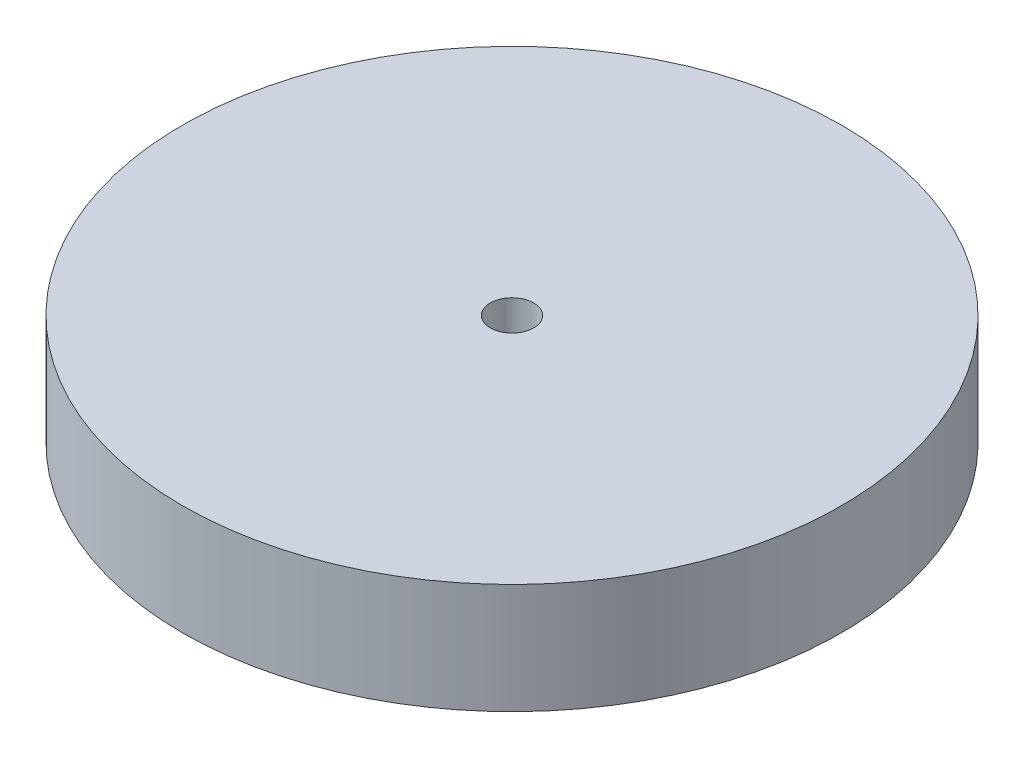
ISO-10303-21;
HEADER;
FILE_DESCRIPTION(('STEP AP214'),'2;1');
FILE_NAME('part.step','',(''),(''),'','','');
FILE_SCHEMA(('AUTOMOTIVE_DESIGN { 1 0 10303 214 1 1 1 1 }'));
ENDSEC;
DATA;
#1=APPLICATION_CONTEXT('core data for automotive mechanical design processes');
#2=APPLICATION_PROTOCOL_DEFINITION('international standard','automotive_design',2000,#1);
#3=PRODUCT_CONTEXT('',#1,'mechanical');
#4=PRODUCT('Part','Part','',(#3));
#5=PRODUCT_RELATED_PRODUCT_CATEGORY('part','',(#4));
#6=PRODUCT_DEFINITION_FORMATION('','',#4);
#7=PRODUCT_DEFINITION_CONTEXT('part definition',#1,'design');
#8=PRODUCT_DEFINITION('design','',#6,#7);
#9=PRODUCT_DEFINITION_SHAPE('','',#8);
#10=(LENGTH_UNIT() NAMED_UNIT(*) SI_UNIT(.MILLI.,.METRE.));
#11=(NAMED_UNIT(*) PLANE_ANGLE_UNIT() SI_UNIT($,.RADIAN.));
#12=(NAMED_UNIT(*) SI_UNIT($,.STERADIAN.) SOLID_ANGLE_UNIT());
#13=UNCERTAINTY_MEASURE_WITH_UNIT(LENGTH_MEASURE(1.E-05),#10,'distance_accuracy_value','');
#14=(GEOMETRIC_REPRESENTATION_CONTEXT(3) GLOBAL_UNCERTAINTY_ASSIGNED_CONTEXT((#13)) GLOBAL_UNIT_ASSIGNED_CONTEXT((#10,
#11,#12)) REPRESENTATION_CONTEXT('',''));
#15=CARTESIAN_POINT('',(0.,0.,0.));
#16=DIRECTION('',(0.,0.,1.));
#17=DIRECTION('',(1.,0.,0.));
#18=AXIS2_PLACEMENT_3D('',#15,#16,#17);
#19=CARTESIAN_POINT('',(0.,6.35,0.));
#20=DIRECTION('',(0.,1.,0.));
#21=DIRECTION('',(0.,0.,1.));
#22=AXIS2_PLACEMENT_3D('',#19,#20,#21);
#23=PLANE('',#22);
#24=CARTESIAN_POINT('',(0.,6.35,0.));
#25=DIRECTION('',(0.,1.,0.));
#26=DIRECTION('',(0.,0.,1.));
#27=AXIS2_PLACEMENT_3D('',#24,#25,#26);
#28=CIRCLE('',#27,38.);
#29=CARTESIAN_POINT('',(0.,6.35,38.));
#30=VERTEX_POINT('',#29);
#31=EDGE_CURVE('E10',#30,#30,#28,.T.);
#32=ORIENTED_EDGE('',*,*,#31,.T.);
#33=EDGE_LOOP('',(#32));
#34=FACE_BOUND('',#33,.T.);
#35=CARTESIAN_POINT('',(0.,6.35,0.));
#36=DIRECTION('',(0.,1.,0.));
#37=DIRECTION('',(0.,0.,1.));
#38=AXIS2_PLACEMENT_3D('',#35,#36,#37);
#39=CIRCLE('',#38,2.5);
#40=CARTESIAN_POINT('',(0.,6.35,2.5));
#41=VERTEX_POINT('',#40);
#42=EDGE_CURVE('E42',#41,#41,#39,.T.);
#43=ORIENTED_EDGE('',*,*,#42,.F.);
#44=EDGE_LOOP('',(#43));
#45=FACE_BOUND('',#44,.T.);
#46=ADVANCED_FACE('F31',(#34,#45),#23,.T.);
#47=CARTESIAN_POINT('',(0.,-6.35,0.));
#48=DIRECTION('',(0.,1.,0.));
#49=DIRECTION('',(0.,0.,1.));
#50=AXIS2_PLACEMENT_3D('',#47,#48,#49);
#51=PLANE('',#50);
#52=CARTESIAN_POINT('',(0.,-6.35,0.));
#53=DIRECTION('',(0.,1.,0.));
#54=DIRECTION('',(0.,0.,1.));
#55=AXIS2_PLACEMENT_3D('',#52,#53,#54);
#56=CIRCLE('',#55,38.);
#57=CARTESIAN_POINT('',(0.,-6.35,38.));
#58=VERTEX_POINT('',#57);
#59=EDGE_CURVE('E35',#58,#58,#56,.T.);
#60=ORIENTED_EDGE('',*,*,#59,.F.);
#61=EDGE_LOOP('',(#60));
#62=FACE_BOUND('',#61,.T.);
#63=CARTESIAN_POINT('',(0.,-6.35,0.));
#64=DIRECTION('',(0.,1.,0.));
#65=DIRECTION('',(0.,0.,1.));
#66=AXIS2_PLACEMENT_3D('',#63,#64,#65);
#67=CIRCLE('',#66,2.5);
#68=CARTESIAN_POINT('',(0.,-6.35,2.5));
#69=VERTEX_POINT('',#68);
#70=EDGE_CURVE('E44',#69,#69,#67,.T.);
#71=ORIENTED_EDGE('',*,*,#70,.T.);
#72=EDGE_LOOP('',(#71));
#73=FACE_BOUND('',#72,.T.);
#74=ADVANCED_FACE('F54',(#62,#73),#51,.F.);
#75=CARTESIAN_POINT('',(0.,6.35,0.));
#76=DIRECTION('',(0.,-1.,0.));
#77=DIRECTION('',(0.,0.,-1.));
#78=AXIS2_PLACEMENT_3D('',#75,#76,#77);
#79=CYLINDRICAL_SURFACE('',#78,38.);
#80=ORIENTED_EDGE('',*,*,#31,.F.);
#81=EDGE_LOOP('',(#80));
#82=FACE_BOUND('',#81,.T.);
#83=ORIENTED_EDGE('',*,*,#59,.T.);
#84=EDGE_LOOP('',(#83));
#85=FACE_BOUND('',#84,.T.);
#86=ADVANCED_FACE('F33',(#82,#85),#79,.T.);
#87=CARTESIAN_POINT('',(0.,6.35,0.));
#88=DIRECTION('',(0.,-1.,0.));
#89=DIRECTION('',(0.,0.,-1.));
#90=AXIS2_PLACEMENT_3D('',#87,#88,#89);
#91=CYLINDRICAL_SURFACE('',#90,2.5);
#92=ORIENTED_EDGE('',*,*,#42,.T.);
#93=EDGE_LOOP('',(#92));
#94=FACE_BOUND('',#93,.T.);
#95=ORIENTED_EDGE('',*,*,#70,.F.);
#96=EDGE_LOOP('',(#95));
#97=FACE_BOUND('',#96,.T.);
#98=ADVANCED_FACE('F50',(#94,#97),#91,.F.);
#99=CLOSED_SHELL('',(#46,#74,#86,#98));
#100=MANIFOLD_SOLID_BREP('B2',#99);
#101=ADVANCED_BREP_SHAPE_REPRESENTATION('',(#18,#100),#14);
#102=SHAPE_DEFINITION_REPRESENTATION(#9,#101);
ENDSEC;
END-ISO-10303-21;
